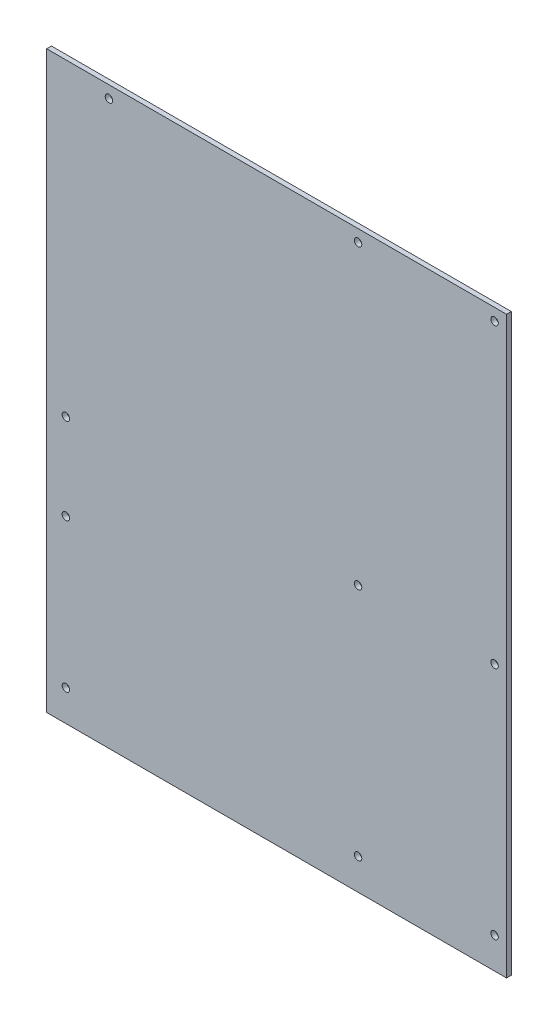
ISO-10303-21;
HEADER;
FILE_DESCRIPTION(('STEP AP214'),'2;1');
FILE_NAME('part.step','',(''),(''),'','','');
FILE_SCHEMA(('AUTOMOTIVE_DESIGN { 1 0 10303 214 1 1 1 1 }'));
ENDSEC;
DATA;
#1=APPLICATION_CONTEXT('core data for automotive mechanical design processes');
#2=APPLICATION_PROTOCOL_DEFINITION('international standard','automotive_design',2000,#1);
#3=PRODUCT_CONTEXT('',#1,'mechanical');
#4=PRODUCT('Part','Part','',(#3));
#5=PRODUCT_RELATED_PRODUCT_CATEGORY('part','',(#4));
#6=PRODUCT_DEFINITION_FORMATION('','',#4);
#7=PRODUCT_DEFINITION_CONTEXT('part definition',#1,'design');
#8=PRODUCT_DEFINITION('design','',#6,#7);
#9=PRODUCT_DEFINITION_SHAPE('','',#8);
#10=(LENGTH_UNIT() NAMED_UNIT(*) SI_UNIT(.MILLI.,.METRE.));
#11=(NAMED_UNIT(*) PLANE_ANGLE_UNIT() SI_UNIT($,.RADIAN.));
#12=(NAMED_UNIT(*) SI_UNIT($,.STERADIAN.) SOLID_ANGLE_UNIT());
#13=UNCERTAINTY_MEASURE_WITH_UNIT(LENGTH_MEASURE(1.E-05),#10,'distance_accuracy_value','');
#14=(GEOMETRIC_REPRESENTATION_CONTEXT(3) GLOBAL_UNCERTAINTY_ASSIGNED_CONTEXT((#13)) GLOBAL_UNIT_ASSIGNED_CONTEXT((#10,
#11,#12)) REPRESENTATION_CONTEXT('',''));
#15=CARTESIAN_POINT('',(0.,0.,0.));
#16=DIRECTION('',(0.,0.,1.));
#17=DIRECTION('',(1.,0.,0.));
#18=AXIS2_PLACEMENT_3D('',#15,#16,#17);
#19=CARTESIAN_POINT('',(0.,0.,2.54));
#20=DIRECTION('',(0.,0.,-1.));
#21=DIRECTION('',(-1.,0.,0.));
#22=AXIS2_PLACEMENT_3D('',#19,#20,#21);
#23=PLANE('',#22);
#24=DIRECTION('',(0.,-1.,0.));
#25=VECTOR('',#24,1.);
#26=CARTESIAN_POINT('',(0.,0.,2.54));
#27=LINE('',#26,#25);
#28=CARTESIAN_POINT('',(0.,304.8,2.54));
#29=VERTEX_POINT('',#28);
#30=CARTESIAN_POINT('',(0.,0.,2.54));
#31=VERTEX_POINT('',#30);
#32=EDGE_CURVE('E85',#29,#31,#27,.T.);
#33=ORIENTED_EDGE('',*,*,#32,.T.);
#34=DIRECTION('',(1.,0.,0.));
#35=VECTOR('',#34,1.);
#36=CARTESIAN_POINT('',(0.,0.,2.54));
#37=LINE('',#36,#35);
#38=CARTESIAN_POINT('',(243.84,0.,2.54));
#39=VERTEX_POINT('',#38);
#40=EDGE_CURVE('E80',#31,#39,#37,.T.);
#41=ORIENTED_EDGE('',*,*,#40,.T.);
#42=DIRECTION('',(0.,1.,0.));
#43=VECTOR('',#42,1.);
#44=CARTESIAN_POINT('',(243.84,0.,2.54));
#45=LINE('',#44,#43);
#46=CARTESIAN_POINT('',(243.84,304.8,2.54));
#47=VERTEX_POINT('',#46);
#48=EDGE_CURVE('E83',#39,#47,#45,.T.);
#49=ORIENTED_EDGE('',*,*,#48,.T.);
#50=DIRECTION('',(-1.,0.,0.));
#51=VECTOR('',#50,1.);
#52=CARTESIAN_POINT('',(0.,304.8,2.54));
#53=LINE('',#52,#51);
#54=EDGE_CURVE('E50',#47,#29,#53,.T.);
#55=ORIENTED_EDGE('',*,*,#54,.T.);
#56=EDGE_LOOP('',(#33,#41,#49,#55));
#57=FACE_BOUND('',#56,.T.);
#58=CARTESIAN_POINT('',(165.1,298.45,2.54));
#59=DIRECTION('',(0.,0.,1.));
#60=DIRECTION('',(1.,0.,0.));
#61=AXIS2_PLACEMENT_3D('',#58,#59,#60);
#62=CIRCLE('',#61,1.98120000000003);
#63=CARTESIAN_POINT('',(167.0812,298.45,2.54));
#64=VERTEX_POINT('',#63);
#65=EDGE_CURVE('E100',#64,#64,#62,.T.);
#66=ORIENTED_EDGE('',*,*,#65,.F.);
#67=EDGE_LOOP('',(#66));
#68=FACE_BOUND('',#67,.T.);
#69=CARTESIAN_POINT('',(237.49,298.45,2.54));
#70=DIRECTION('',(0.,0.,1.));
#71=DIRECTION('',(1.,0.,0.));
#72=AXIS2_PLACEMENT_3D('',#69,#70,#71);
#73=CIRCLE('',#72,1.98120000000003);
#74=CARTESIAN_POINT('',(239.4712,298.45,2.54));
#75=VERTEX_POINT('',#74);
#76=EDGE_CURVE('E115',#75,#75,#73,.T.);
#77=ORIENTED_EDGE('',*,*,#76,.F.);
#78=EDGE_LOOP('',(#77));
#79=FACE_BOUND('',#78,.T.);
#80=CARTESIAN_POINT('',(237.49,140.97,2.54));
#81=DIRECTION('',(0.,0.,1.));
#82=DIRECTION('',(1.,0.,0.));
#83=AXIS2_PLACEMENT_3D('',#80,#81,#82);
#84=CIRCLE('',#83,1.9812);
#85=CARTESIAN_POINT('',(239.4712,140.97,2.54));
#86=VERTEX_POINT('',#85);
#87=EDGE_CURVE('E121',#86,#86,#84,.T.);
#88=ORIENTED_EDGE('',*,*,#87,.F.);
#89=EDGE_LOOP('',(#88));
#90=FACE_BOUND('',#89,.T.);
#91=CARTESIAN_POINT('',(165.1,140.97,2.54));
#92=DIRECTION('',(0.,0.,1.));
#93=DIRECTION('',(1.,0.,0.));
#94=AXIS2_PLACEMENT_3D('',#91,#92,#93);
#95=CIRCLE('',#94,1.9812);
#96=CARTESIAN_POINT('',(167.0812,140.97,2.54));
#97=VERTEX_POINT('',#96);
#98=EDGE_CURVE('E127',#97,#97,#95,.T.);
#99=ORIENTED_EDGE('',*,*,#98,.F.);
#100=EDGE_LOOP('',(#99));
#101=FACE_BOUND('',#100,.T.);
#102=CARTESIAN_POINT('',(10.16,140.97,2.54));
#103=DIRECTION('',(0.,0.,1.));
#104=DIRECTION('',(1.,0.,0.));
#105=AXIS2_PLACEMENT_3D('',#102,#103,#104);
#106=CIRCLE('',#105,1.98119999999999);
#107=CARTESIAN_POINT('',(12.1412,140.97,2.54));
#108=VERTEX_POINT('',#107);
#109=EDGE_CURVE('E133',#108,#108,#106,.T.);
#110=ORIENTED_EDGE('',*,*,#109,.F.);
#111=EDGE_LOOP('',(#110));
#112=FACE_BOUND('',#111,.T.);
#113=CARTESIAN_POINT('',(10.16,16.51,2.54));
#114=DIRECTION('',(0.,0.,1.));
#115=DIRECTION('',(1.,0.,0.));
#116=AXIS2_PLACEMENT_3D('',#113,#114,#115);
#117=CIRCLE('',#116,1.9812);
#118=CARTESIAN_POINT('',(12.1412,16.51,2.54));
#119=VERTEX_POINT('',#118);
#120=EDGE_CURVE('E139',#119,#119,#117,.T.);
#121=ORIENTED_EDGE('',*,*,#120,.F.);
#122=EDGE_LOOP('',(#121));
#123=FACE_BOUND('',#122,.T.);
#124=CARTESIAN_POINT('',(165.1,16.51,2.54));
#125=DIRECTION('',(0.,0.,1.));
#126=DIRECTION('',(1.,0.,0.));
#127=AXIS2_PLACEMENT_3D('',#124,#125,#126);
#128=CIRCLE('',#127,1.9812);
#129=CARTESIAN_POINT('',(167.0812,16.51,2.54));
#130=VERTEX_POINT('',#129);
#131=EDGE_CURVE('E145',#130,#130,#128,.T.);
#132=ORIENTED_EDGE('',*,*,#131,.F.);
#133=EDGE_LOOP('',(#132));
#134=FACE_BOUND('',#133,.T.);
#135=CARTESIAN_POINT('',(237.49,16.51,2.54));
#136=DIRECTION('',(0.,0.,1.));
#137=DIRECTION('',(1.,0.,0.));
#138=AXIS2_PLACEMENT_3D('',#135,#136,#137);
#139=CIRCLE('',#138,1.9812);
#140=CARTESIAN_POINT('',(239.4712,16.51,2.54));
#141=VERTEX_POINT('',#140);
#142=EDGE_CURVE('E151',#141,#141,#139,.T.);
#143=ORIENTED_EDGE('',*,*,#142,.F.);
#144=EDGE_LOOP('',(#143));
#145=FACE_BOUND('',#144,.T.);
#146=CARTESIAN_POINT('',(33.02,298.45,2.54));
#147=DIRECTION('',(0.,0.,1.));
#148=DIRECTION('',(1.,0.,0.));
#149=AXIS2_PLACEMENT_3D('',#146,#147,#148);
#150=CIRCLE('',#149,1.98120000000004);
#151=CARTESIAN_POINT('',(35.0012,298.45,2.54));
#152=VERTEX_POINT('',#151);
#153=EDGE_CURVE('E157',#152,#152,#150,.T.);
#154=ORIENTED_EDGE('',*,*,#153,.F.);
#155=EDGE_LOOP('',(#154));
#156=FACE_BOUND('',#155,.T.);
#157=CARTESIAN_POINT('',(10.16,95.25,2.54));
#158=DIRECTION('',(0.,0.,1.));
#159=DIRECTION('',(1.,0.,0.));
#160=AXIS2_PLACEMENT_3D('',#157,#158,#159);
#161=CIRCLE('',#160,1.98120000000003);
#162=CARTESIAN_POINT('',(12.1412000000001,95.25,2.54));
#163=VERTEX_POINT('',#162);
#164=EDGE_CURVE('E163',#163,#163,#161,.T.);
#165=ORIENTED_EDGE('',*,*,#164,.F.);
#166=EDGE_LOOP('',(#165));
#167=FACE_BOUND('',#166,.T.);
#168=ADVANCED_FACE('F33',(#57,#68,#79,#90,#101,#112,#123,#134,#145,#156,#167),#23,.F.);
#169=CARTESIAN_POINT('',(0.,0.,0.));
#170=DIRECTION('',(0.,0.,-1.));
#171=DIRECTION('',(-1.,0.,0.));
#172=AXIS2_PLACEMENT_3D('',#169,#170,#171);
#173=PLANE('',#172);
#174=CARTESIAN_POINT('',(33.02,298.45,0.));
#175=DIRECTION('',(0.,0.,1.));
#176=DIRECTION('',(1.,0.,0.));
#177=AXIS2_PLACEMENT_3D('',#174,#175,#176);
#178=CIRCLE('',#177,1.98120000000004);
#179=CARTESIAN_POINT('',(35.0012,298.45,0.));
#180=VERTEX_POINT('',#179);
#181=EDGE_CURVE('E160',#180,#180,#178,.T.);
#182=ORIENTED_EDGE('',*,*,#181,.T.);
#183=EDGE_LOOP('',(#182));
#184=FACE_BOUND('',#183,.T.);
#185=CARTESIAN_POINT('',(165.1,16.51,0.));
#186=DIRECTION('',(0.,0.,1.));
#187=DIRECTION('',(1.,0.,0.));
#188=AXIS2_PLACEMENT_3D('',#185,#186,#187);
#189=CIRCLE('',#188,1.9812);
#190=CARTESIAN_POINT('',(167.0812,16.51,0.));
#191=VERTEX_POINT('',#190);
#192=EDGE_CURVE('E148',#191,#191,#189,.T.);
#193=ORIENTED_EDGE('',*,*,#192,.T.);
#194=EDGE_LOOP('',(#193));
#195=FACE_BOUND('',#194,.T.);
#196=CARTESIAN_POINT('',(10.16,140.97,0.));
#197=DIRECTION('',(0.,0.,1.));
#198=DIRECTION('',(1.,0.,0.));
#199=AXIS2_PLACEMENT_3D('',#196,#197,#198);
#200=CIRCLE('',#199,1.98119999999999);
#201=CARTESIAN_POINT('',(12.1412,140.97,0.));
#202=VERTEX_POINT('',#201);
#203=EDGE_CURVE('E136',#202,#202,#200,.T.);
#204=ORIENTED_EDGE('',*,*,#203,.T.);
#205=EDGE_LOOP('',(#204));
#206=FACE_BOUND('',#205,.T.);
#207=CARTESIAN_POINT('',(237.49,140.97,0.));
#208=DIRECTION('',(0.,0.,1.));
#209=DIRECTION('',(1.,0.,0.));
#210=AXIS2_PLACEMENT_3D('',#207,#208,#209);
#211=CIRCLE('',#210,1.9812);
#212=CARTESIAN_POINT('',(239.4712,140.97,0.));
#213=VERTEX_POINT('',#212);
#214=EDGE_CURVE('E124',#213,#213,#211,.T.);
#215=ORIENTED_EDGE('',*,*,#214,.T.);
#216=EDGE_LOOP('',(#215));
#217=FACE_BOUND('',#216,.T.);
#218=CARTESIAN_POINT('',(165.1,298.45,0.));
#219=DIRECTION('',(0.,0.,1.));
#220=DIRECTION('',(1.,0.,0.));
#221=AXIS2_PLACEMENT_3D('',#218,#219,#220);
#222=CIRCLE('',#221,1.98120000000003);
#223=CARTESIAN_POINT('',(167.0812,298.45,0.));
#224=VERTEX_POINT('',#223);
#225=EDGE_CURVE('E112',#224,#224,#222,.T.);
#226=ORIENTED_EDGE('',*,*,#225,.T.);
#227=EDGE_LOOP('',(#226));
#228=FACE_BOUND('',#227,.T.);
#229=DIRECTION('',(0.,-1.,0.));
#230=VECTOR('',#229,1.);
#231=CARTESIAN_POINT('',(0.,0.,0.));
#232=LINE('',#231,#230);
#233=CARTESIAN_POINT('',(0.,304.8,0.));
#234=VERTEX_POINT('',#233);
#235=CARTESIAN_POINT('',(0.,0.,0.));
#236=VERTEX_POINT('',#235);
#237=EDGE_CURVE('E97',#234,#236,#232,.T.);
#238=ORIENTED_EDGE('',*,*,#237,.F.);
#239=DIRECTION('',(-1.,0.,0.));
#240=VECTOR('',#239,1.);
#241=CARTESIAN_POINT('',(0.,304.8,0.));
#242=LINE('',#241,#240);
#243=CARTESIAN_POINT('',(243.84,304.8,0.));
#244=VERTEX_POINT('',#243);
#245=EDGE_CURVE('E73',#244,#234,#242,.T.);
#246=ORIENTED_EDGE('',*,*,#245,.F.);
#247=DIRECTION('',(0.,1.,0.));
#248=VECTOR('',#247,1.);
#249=CARTESIAN_POINT('',(243.84,0.,0.));
#250=LINE('',#249,#248);
#251=CARTESIAN_POINT('',(243.84,0.,0.));
#252=VERTEX_POINT('',#251);
#253=EDGE_CURVE('E67',#252,#244,#250,.T.);
#254=ORIENTED_EDGE('',*,*,#253,.F.);
#255=DIRECTION('',(1.,0.,0.));
#256=VECTOR('',#255,1.);
#257=CARTESIAN_POINT('',(0.,0.,0.));
#258=LINE('',#257,#256);
#259=EDGE_CURVE('E89',#236,#252,#258,.T.);
#260=ORIENTED_EDGE('',*,*,#259,.F.);
#261=EDGE_LOOP('',(#238,#246,#254,#260));
#262=FACE_BOUND('',#261,.T.);
#263=CARTESIAN_POINT('',(237.49,298.45,0.));
#264=DIRECTION('',(0.,0.,1.));
#265=DIRECTION('',(1.,0.,0.));
#266=AXIS2_PLACEMENT_3D('',#263,#264,#265);
#267=CIRCLE('',#266,1.98120000000003);
#268=CARTESIAN_POINT('',(239.4712,298.45,0.));
#269=VERTEX_POINT('',#268);
#270=EDGE_CURVE('E118',#269,#269,#267,.T.);
#271=ORIENTED_EDGE('',*,*,#270,.T.);
#272=EDGE_LOOP('',(#271));
#273=FACE_BOUND('',#272,.T.);
#274=CARTESIAN_POINT('',(165.1,140.97,0.));
#275=DIRECTION('',(0.,0.,1.));
#276=DIRECTION('',(1.,0.,0.));
#277=AXIS2_PLACEMENT_3D('',#274,#275,#276);
#278=CIRCLE('',#277,1.9812);
#279=CARTESIAN_POINT('',(167.0812,140.97,0.));
#280=VERTEX_POINT('',#279);
#281=EDGE_CURVE('E130',#280,#280,#278,.T.);
#282=ORIENTED_EDGE('',*,*,#281,.T.);
#283=EDGE_LOOP('',(#282));
#284=FACE_BOUND('',#283,.T.);
#285=CARTESIAN_POINT('',(10.16,16.51,0.));
#286=DIRECTION('',(0.,0.,1.));
#287=DIRECTION('',(1.,0.,0.));
#288=AXIS2_PLACEMENT_3D('',#285,#286,#287);
#289=CIRCLE('',#288,1.9812);
#290=CARTESIAN_POINT('',(12.1412,16.51,0.));
#291=VERTEX_POINT('',#290);
#292=EDGE_CURVE('E142',#291,#291,#289,.T.);
#293=ORIENTED_EDGE('',*,*,#292,.T.);
#294=EDGE_LOOP('',(#293));
#295=FACE_BOUND('',#294,.T.);
#296=CARTESIAN_POINT('',(237.49,16.51,0.));
#297=DIRECTION('',(0.,0.,1.));
#298=DIRECTION('',(1.,0.,0.));
#299=AXIS2_PLACEMENT_3D('',#296,#297,#298);
#300=CIRCLE('',#299,1.9812);
#301=CARTESIAN_POINT('',(239.4712,16.51,0.));
#302=VERTEX_POINT('',#301);
#303=EDGE_CURVE('E154',#302,#302,#300,.T.);
#304=ORIENTED_EDGE('',*,*,#303,.T.);
#305=EDGE_LOOP('',(#304));
#306=FACE_BOUND('',#305,.T.);
#307=CARTESIAN_POINT('',(10.16,95.25,0.));
#308=DIRECTION('',(0.,0.,1.));
#309=DIRECTION('',(1.,0.,0.));
#310=AXIS2_PLACEMENT_3D('',#307,#308,#309);
#311=CIRCLE('',#310,1.98120000000003);
#312=CARTESIAN_POINT('',(12.1412000000001,95.25,0.));
#313=VERTEX_POINT('',#312);
#314=EDGE_CURVE('E166',#313,#313,#311,.T.);
#315=ORIENTED_EDGE('',*,*,#314,.T.);
#316=EDGE_LOOP('',(#315));
#317=FACE_BOUND('',#316,.T.);
#318=ADVANCED_FACE('F108',(#184,#195,#206,#217,#228,#262,#273,#284,#295,#306,#317),#173,.T.);
#319=CARTESIAN_POINT('',(0.,0.,2.54));
#320=DIRECTION('',(1.,0.,0.));
#321=DIRECTION('',(0.,0.,-1.));
#322=AXIS2_PLACEMENT_3D('',#319,#320,#321);
#323=PLANE('',#322);
#324=ORIENTED_EDGE('',*,*,#237,.T.);
#325=DIRECTION('',(0.,0.,-1.));
#326=VECTOR('',#325,1.);
#327=CARTESIAN_POINT('',(0.,0.,2.54));
#328=LINE('',#327,#326);
#329=EDGE_CURVE('E11',#31,#236,#328,.T.);
#330=ORIENTED_EDGE('',*,*,#329,.F.);
#331=ORIENTED_EDGE('',*,*,#32,.F.);
#332=DIRECTION('',(0.,0.,-1.));
#333=VECTOR('',#332,1.);
#334=CARTESIAN_POINT('',(0.,304.8,2.54));
#335=LINE('',#334,#333);
#336=EDGE_CURVE('E93',#29,#234,#335,.T.);
#337=ORIENTED_EDGE('',*,*,#336,.T.);
#338=EDGE_LOOP('',(#324,#330,#331,#337));
#339=FACE_BOUND('',#338,.T.);
#340=ADVANCED_FACE('F35',(#339),#323,.F.);
#341=CARTESIAN_POINT('',(0.,0.,2.54));
#342=DIRECTION('',(0.,1.,0.));
#343=DIRECTION('',(0.,0.,1.));
#344=AXIS2_PLACEMENT_3D('',#341,#342,#343);
#345=PLANE('',#344);
#346=ORIENTED_EDGE('',*,*,#259,.T.);
#347=DIRECTION('',(0.,0.,-1.));
#348=VECTOR('',#347,1.);
#349=CARTESIAN_POINT('',(243.84,0.,2.54));
#350=LINE('',#349,#348);
#351=EDGE_CURVE('E42',#39,#252,#350,.T.);
#352=ORIENTED_EDGE('',*,*,#351,.F.);
#353=ORIENTED_EDGE('',*,*,#40,.F.);
#354=ORIENTED_EDGE('',*,*,#329,.T.);
#355=EDGE_LOOP('',(#346,#352,#353,#354));
#356=FACE_BOUND('',#355,.T.);
#357=ADVANCED_FACE('F88',(#356),#345,.F.);
#358=CARTESIAN_POINT('',(243.84,0.,2.54));
#359=DIRECTION('',(-1.,0.,0.));
#360=DIRECTION('',(0.,-1.,0.));
#361=AXIS2_PLACEMENT_3D('',#358,#359,#360);
#362=PLANE('',#361);
#363=ORIENTED_EDGE('',*,*,#253,.T.);
#364=DIRECTION('',(0.,0.,-1.));
#365=VECTOR('',#364,1.);
#366=CARTESIAN_POINT('',(243.84,304.8,2.54));
#367=LINE('',#366,#365);
#368=EDGE_CURVE('E90',#47,#244,#367,.T.);
#369=ORIENTED_EDGE('',*,*,#368,.F.);
#370=ORIENTED_EDGE('',*,*,#48,.F.);
#371=ORIENTED_EDGE('',*,*,#351,.T.);
#372=EDGE_LOOP('',(#363,#369,#370,#371));
#373=FACE_BOUND('',#372,.T.);
#374=ADVANCED_FACE('F91',(#373),#362,.F.);
#375=CARTESIAN_POINT('',(0.,304.8,2.54));
#376=DIRECTION('',(0.,-1.,0.));
#377=DIRECTION('',(0.,0.,-1.));
#378=AXIS2_PLACEMENT_3D('',#375,#376,#377);
#379=PLANE('',#378);
#380=ORIENTED_EDGE('',*,*,#245,.T.);
#381=ORIENTED_EDGE('',*,*,#336,.F.);
#382=ORIENTED_EDGE('',*,*,#54,.F.);
#383=ORIENTED_EDGE('',*,*,#368,.T.);
#384=EDGE_LOOP('',(#380,#381,#382,#383));
#385=FACE_BOUND('',#384,.T.);
#386=ADVANCED_FACE('F105',(#385),#379,.F.);
#387=CARTESIAN_POINT('',(165.1,298.45,2.54));
#388=DIRECTION('',(0.,0.,-1.));
#389=DIRECTION('',(-1.,0.,0.));
#390=AXIS2_PLACEMENT_3D('',#387,#388,#389);
#391=CYLINDRICAL_SURFACE('',#390,1.98120000000003);
#392=ORIENTED_EDGE('',*,*,#65,.T.);
#393=EDGE_LOOP('',(#392));
#394=FACE_BOUND('',#393,.T.);
#395=ORIENTED_EDGE('',*,*,#225,.F.);
#396=EDGE_LOOP('',(#395));
#397=FACE_BOUND('',#396,.T.);
#398=ADVANCED_FACE('F183',(#394,#397),#391,.F.);
#399=CARTESIAN_POINT('',(237.49,298.45,2.54));
#400=DIRECTION('',(0.,0.,-1.));
#401=DIRECTION('',(-1.,0.,0.));
#402=AXIS2_PLACEMENT_3D('',#399,#400,#401);
#403=CYLINDRICAL_SURFACE('',#402,1.98120000000003);
#404=ORIENTED_EDGE('',*,*,#76,.T.);
#405=EDGE_LOOP('',(#404));
#406=FACE_BOUND('',#405,.T.);
#407=ORIENTED_EDGE('',*,*,#270,.F.);
#408=EDGE_LOOP('',(#407));
#409=FACE_BOUND('',#408,.T.);
#410=ADVANCED_FACE('F229',(#406,#409),#403,.F.);
#411=CARTESIAN_POINT('',(237.49,140.97,2.54));
#412=DIRECTION('',(0.,0.,-1.));
#413=DIRECTION('',(-1.,0.,0.));
#414=AXIS2_PLACEMENT_3D('',#411,#412,#413);
#415=CYLINDRICAL_SURFACE('',#414,1.9812);
#416=ORIENTED_EDGE('',*,*,#87,.T.);
#417=EDGE_LOOP('',(#416));
#418=FACE_BOUND('',#417,.T.);
#419=ORIENTED_EDGE('',*,*,#214,.F.);
#420=EDGE_LOOP('',(#419));
#421=FACE_BOUND('',#420,.T.);
#422=ADVANCED_FACE('F237',(#418,#421),#415,.F.);
#423=CARTESIAN_POINT('',(165.1,140.97,2.54));
#424=DIRECTION('',(0.,0.,-1.));
#425=DIRECTION('',(-1.,0.,0.));
#426=AXIS2_PLACEMENT_3D('',#423,#424,#425);
#427=CYLINDRICAL_SURFACE('',#426,1.9812);
#428=ORIENTED_EDGE('',*,*,#98,.T.);
#429=EDGE_LOOP('',(#428));
#430=FACE_BOUND('',#429,.T.);
#431=ORIENTED_EDGE('',*,*,#281,.F.);
#432=EDGE_LOOP('',(#431));
#433=FACE_BOUND('',#432,.T.);
#434=ADVANCED_FACE('F245',(#430,#433),#427,.F.);
#435=CARTESIAN_POINT('',(10.16,140.97,2.54));
#436=DIRECTION('',(0.,0.,-1.));
#437=DIRECTION('',(-1.,0.,0.));
#438=AXIS2_PLACEMENT_3D('',#435,#436,#437);
#439=CYLINDRICAL_SURFACE('',#438,1.98119999999999);
#440=ORIENTED_EDGE('',*,*,#109,.T.);
#441=EDGE_LOOP('',(#440));
#442=FACE_BOUND('',#441,.T.);
#443=ORIENTED_EDGE('',*,*,#203,.F.);
#444=EDGE_LOOP('',(#443));
#445=FACE_BOUND('',#444,.T.);
#446=ADVANCED_FACE('F254',(#442,#445),#439,.F.);
#447=CARTESIAN_POINT('',(10.16,16.51,2.54));
#448=DIRECTION('',(0.,0.,-1.));
#449=DIRECTION('',(-1.,0.,0.));
#450=AXIS2_PLACEMENT_3D('',#447,#448,#449);
#451=CYLINDRICAL_SURFACE('',#450,1.9812);
#452=ORIENTED_EDGE('',*,*,#120,.T.);
#453=EDGE_LOOP('',(#452));
#454=FACE_BOUND('',#453,.T.);
#455=ORIENTED_EDGE('',*,*,#292,.F.);
#456=EDGE_LOOP('',(#455));
#457=FACE_BOUND('',#456,.T.);
#458=ADVANCED_FACE('F263',(#454,#457),#451,.F.);
#459=CARTESIAN_POINT('',(165.1,16.51,2.54));
#460=DIRECTION('',(0.,0.,-1.));
#461=DIRECTION('',(-1.,0.,0.));
#462=AXIS2_PLACEMENT_3D('',#459,#460,#461);
#463=CYLINDRICAL_SURFACE('',#462,1.9812);
#464=ORIENTED_EDGE('',*,*,#131,.T.);
#465=EDGE_LOOP('',(#464));
#466=FACE_BOUND('',#465,.T.);
#467=ORIENTED_EDGE('',*,*,#192,.F.);
#468=EDGE_LOOP('',(#467));
#469=FACE_BOUND('',#468,.T.);
#470=ADVANCED_FACE('F272',(#466,#469),#463,.F.);
#471=CARTESIAN_POINT('',(237.49,16.51,2.54));
#472=DIRECTION('',(0.,0.,-1.));
#473=DIRECTION('',(-1.,0.,0.));
#474=AXIS2_PLACEMENT_3D('',#471,#472,#473);
#475=CYLINDRICAL_SURFACE('',#474,1.9812);
#476=ORIENTED_EDGE('',*,*,#142,.T.);
#477=EDGE_LOOP('',(#476));
#478=FACE_BOUND('',#477,.T.);
#479=ORIENTED_EDGE('',*,*,#303,.F.);
#480=EDGE_LOOP('',(#479));
#481=FACE_BOUND('',#480,.T.);
#482=ADVANCED_FACE('F281',(#478,#481),#475,.F.);
#483=CARTESIAN_POINT('',(33.02,298.45,2.54));
#484=DIRECTION('',(0.,0.,-1.));
#485=DIRECTION('',(-1.,0.,0.));
#486=AXIS2_PLACEMENT_3D('',#483,#484,#485);
#487=CYLINDRICAL_SURFACE('',#486,1.98120000000004);
#488=ORIENTED_EDGE('',*,*,#153,.T.);
#489=EDGE_LOOP('',(#488));
#490=FACE_BOUND('',#489,.T.);
#491=ORIENTED_EDGE('',*,*,#181,.F.);
#492=EDGE_LOOP('',(#491));
#493=FACE_BOUND('',#492,.T.);
#494=ADVANCED_FACE('F290',(#490,#493),#487,.F.);
#495=CARTESIAN_POINT('',(10.16,95.25,2.54));
#496=DIRECTION('',(0.,0.,-1.));
#497=DIRECTION('',(-1.,0.,0.));
#498=AXIS2_PLACEMENT_3D('',#495,#496,#497);
#499=CYLINDRICAL_SURFACE('',#498,1.98120000000003);
#500=ORIENTED_EDGE('',*,*,#164,.T.);
#501=EDGE_LOOP('',(#500));
#502=FACE_BOUND('',#501,.T.);
#503=ORIENTED_EDGE('',*,*,#314,.F.);
#504=EDGE_LOOP('',(#503));
#505=FACE_BOUND('',#504,.T.);
#506=ADVANCED_FACE('F172',(#502,#505),#499,.F.);
#507=CLOSED_SHELL('',(#168,#318,#340,#357,#374,#386,#398,#410,#422,#434,#446,#458,#470,#482,
#494,#506));
#508=MANIFOLD_SOLID_BREP('B2',#507);
#509=ADVANCED_BREP_SHAPE_REPRESENTATION('',(#18,#508),#14);
#510=SHAPE_DEFINITION_REPRESENTATION(#9,#509);
ENDSEC;
END-ISO-10303-21;
